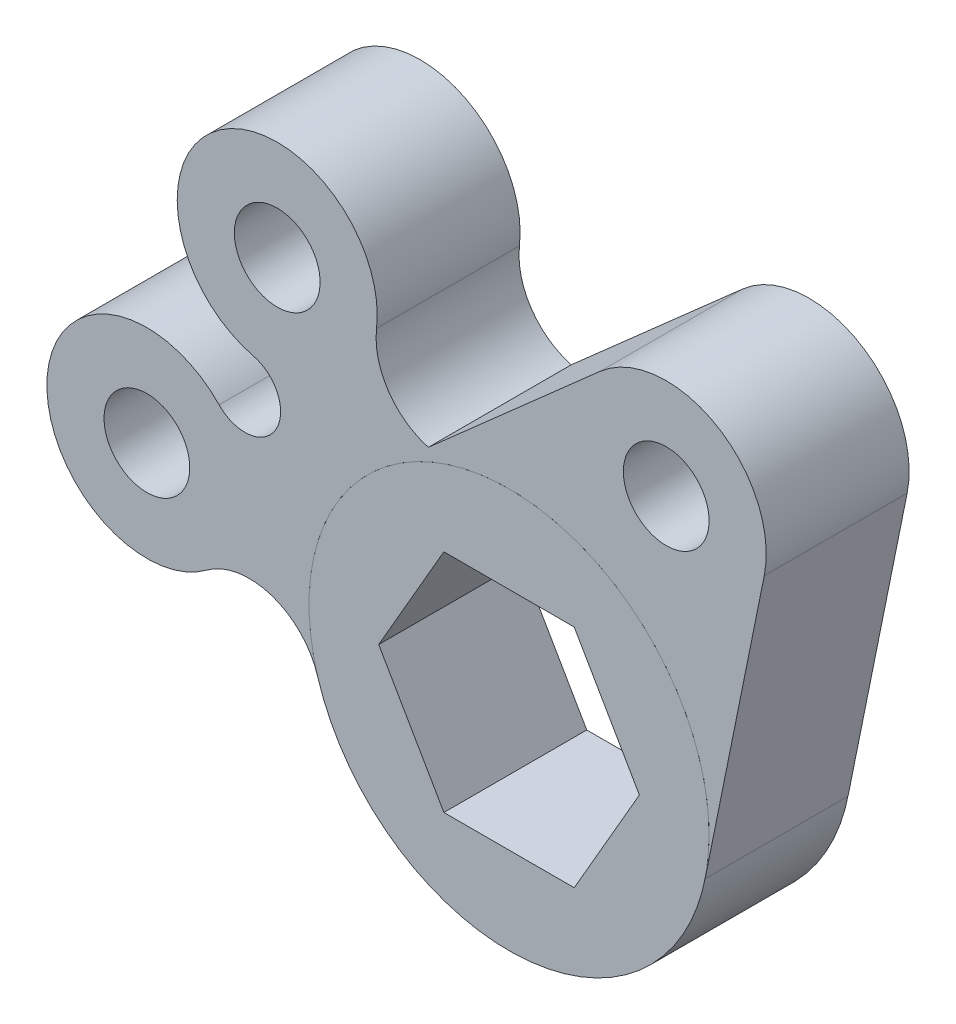
ISO-10303-21;
HEADER;
FILE_DESCRIPTION(('STEP AP214'),'2;1');
FILE_NAME('part.step','',(''),(''),'','','');
FILE_SCHEMA(('AUTOMOTIVE_DESIGN { 1 0 10303 214 1 1 1 1 }'));
ENDSEC;
DATA;
#1=APPLICATION_CONTEXT('core data for automotive mechanical design processes');
#2=APPLICATION_PROTOCOL_DEFINITION('international standard','automotive_design',2000,#1);
#3=PRODUCT_CONTEXT('',#1,'mechanical');
#4=PRODUCT('Part','Part','',(#3));
#5=PRODUCT_RELATED_PRODUCT_CATEGORY('part','',(#4));
#6=PRODUCT_DEFINITION_FORMATION('','',#4);
#7=PRODUCT_DEFINITION_CONTEXT('part definition',#1,'design');
#8=PRODUCT_DEFINITION('design','',#6,#7);
#9=PRODUCT_DEFINITION_SHAPE('','',#8);
#10=(LENGTH_UNIT() NAMED_UNIT(*) SI_UNIT(.MILLI.,.METRE.));
#11=(NAMED_UNIT(*) PLANE_ANGLE_UNIT() SI_UNIT($,.RADIAN.));
#12=(NAMED_UNIT(*) SI_UNIT($,.STERADIAN.) SOLID_ANGLE_UNIT());
#13=UNCERTAINTY_MEASURE_WITH_UNIT(LENGTH_MEASURE(1.E-05),#10,'distance_accuracy_value','');
#14=(GEOMETRIC_REPRESENTATION_CONTEXT(3) GLOBAL_UNCERTAINTY_ASSIGNED_CONTEXT((#13)) GLOBAL_UNIT_ASSIGNED_CONTEXT((#10,
#11,#12)) REPRESENTATION_CONTEXT('',''));
#15=CARTESIAN_POINT('',(0.,0.,0.));
#16=DIRECTION('',(0.,0.,1.));
#17=DIRECTION('',(1.,0.,0.));
#18=AXIS2_PLACEMENT_3D('',#15,#16,#17);
#19=CARTESIAN_POINT('',(-2.15239809910652,9.2529553345384,5.));
#20=DIRECTION('',(0.,0.,-1.));
#21=DIRECTION('',(-1.,0.,0.));
#22=AXIS2_PLACEMENT_3D('',#19,#20,#21);
#23=CYLINDRICAL_SURFACE('',#22,2.5);
#24=CARTESIAN_POINT('',(-2.15239809910652,9.2529553345384,0.));
#25=DIRECTION('',(0.,0.,-1.));
#26=DIRECTION('',(-1.,0.,0.));
#27=AXIS2_PLACEMENT_3D('',#24,#25,#26);
#28=CIRCLE('',#27,2.5);
#29=CARTESIAN_POINT('',(-2.82403678290388,6.84486449770791,0.));
#30=VERTEX_POINT('',#29);
#31=CARTESIAN_POINT('',(-4.63547025869307,9.54339061181407,0.));
#32=VERTEX_POINT('',#31);
#33=EDGE_CURVE('E157',#30,#32,#28,.T.);
#34=ORIENTED_EDGE('',*,*,#33,.T.);
#35=DIRECTION('',(0.,0.,-1.));
#36=VECTOR('',#35,1.);
#37=CARTESIAN_POINT('',(-4.63547025869307,9.54339061181407,5.));
#38=LINE('',#37,#36);
#39=CARTESIAN_POINT('',(-4.63547025869307,9.54339061181407,5.));
#40=VERTEX_POINT('',#39);
#41=EDGE_CURVE('E12',#40,#32,#38,.T.);
#42=ORIENTED_EDGE('',*,*,#41,.F.);
#43=CARTESIAN_POINT('',(-2.15239809910652,9.2529553345384,5.));
#44=DIRECTION('',(0.,0.,-1.));
#45=DIRECTION('',(-1.,0.,0.));
#46=AXIS2_PLACEMENT_3D('',#43,#44,#45);
#47=CIRCLE('',#46,2.5);
#48=CARTESIAN_POINT('',(-2.82403678290388,6.84486449770791,5.));
#49=VERTEX_POINT('',#48);
#50=EDGE_CURVE('E63',#49,#40,#47,.T.);
#51=ORIENTED_EDGE('',*,*,#50,.F.);
#52=DIRECTION('',(0.,0.,-1.));
#53=VECTOR('',#52,1.);
#54=CARTESIAN_POINT('',(-2.82403678290388,6.84486449770791,5.));
#55=LINE('',#54,#53);
#56=EDGE_CURVE('E48',#49,#30,#55,.T.);
#57=ORIENTED_EDGE('',*,*,#56,.T.);
#58=EDGE_LOOP('',(#34,#42,#51,#57));
#59=FACE_BOUND('',#58,.T.);
#60=ADVANCED_FACE('F45',(#59),#23,.F.);
#61=CARTESIAN_POINT('',(-8.11177128211424,9.95,5.));
#62=DIRECTION('',(0.,0.,-1.));
#63=DIRECTION('',(-1.,0.,0.));
#64=AXIS2_PLACEMENT_3D('',#61,#62,#63);
#65=CYLINDRICAL_SURFACE('',#64,3.5);
#66=CARTESIAN_POINT('',(-8.11177128211424,9.95,0.));
#67=DIRECTION('',(0.,0.,-1.));
#68=DIRECTION('',(-1.,0.,0.));
#69=AXIS2_PLACEMENT_3D('',#66,#67,#68);
#70=CIRCLE('',#69,3.5);
#71=CARTESIAN_POINT('',(-8.94579774924383,6.55082365092258,0.));
#72=VERTEX_POINT('',#71);
#73=EDGE_CURVE('E175',#72,#32,#70,.T.);
#74=ORIENTED_EDGE('',*,*,#73,.F.);
#75=DIRECTION('',(0.,0.,-1.));
#76=VECTOR('',#75,1.);
#77=CARTESIAN_POINT('',(-8.94579774924383,6.55082365092258,5.));
#78=LINE('',#77,#76);
#79=CARTESIAN_POINT('',(-8.94579774924383,6.55082365092258,5.));
#80=VERTEX_POINT('',#79);
#81=EDGE_CURVE('E54',#80,#72,#78,.T.);
#82=ORIENTED_EDGE('',*,*,#81,.F.);
#83=CARTESIAN_POINT('',(-8.11177128211424,9.95,5.));
#84=DIRECTION('',(0.,0.,-1.));
#85=DIRECTION('',(-1.,0.,0.));
#86=AXIS2_PLACEMENT_3D('',#83,#84,#85);
#87=CIRCLE('',#86,3.5);
#88=EDGE_CURVE('E129',#80,#40,#87,.T.);
#89=ORIENTED_EDGE('',*,*,#88,.T.);
#90=ORIENTED_EDGE('',*,*,#41,.T.);
#91=EDGE_LOOP('',(#74,#82,#89,#90));
#92=FACE_BOUND('',#91,.T.);
#93=ADVANCED_FACE('F205',(#92),#65,.T.);
#94=CARTESIAN_POINT('',(-9.24366434464725,5.33683209768064,5.));
#95=DIRECTION('',(0.,0.,-1.));
#96=DIRECTION('',(-1.,0.,0.));
#97=AXIS2_PLACEMENT_3D('',#94,#95,#96);
#98=CYLINDRICAL_SURFACE('',#97,1.25);
#99=CARTESIAN_POINT('',(-9.24366434464725,5.33683209768064,0.));
#100=DIRECTION('',(0.,0.,-1.));
#101=DIRECTION('',(-1.,0.,0.));
#102=AXIS2_PLACEMENT_3D('',#99,#100,#101);
#103=CIRCLE('',#102,1.25);
#104=CARTESIAN_POINT('',(-10.1460785720328,4.47187628250153,0.));
#105=VERTEX_POINT('',#104);
#106=EDGE_CURVE('E133',#72,#105,#103,.T.);
#107=ORIENTED_EDGE('',*,*,#106,.T.);
#108=DIRECTION('',(0.,0.,-1.));
#109=VECTOR('',#108,1.);
#110=CARTESIAN_POINT('',(-10.1460785720328,4.47187628250153,5.));
#111=LINE('',#110,#109);
#112=CARTESIAN_POINT('',(-10.1460785720328,4.47187628250153,5.));
#113=VERTEX_POINT('',#112);
#114=EDGE_CURVE('E131',#113,#105,#111,.T.);
#115=ORIENTED_EDGE('',*,*,#114,.F.);
#116=CARTESIAN_POINT('',(-9.24366434464725,5.33683209768064,5.));
#117=DIRECTION('',(0.,0.,-1.));
#118=DIRECTION('',(-1.,0.,0.));
#119=AXIS2_PLACEMENT_3D('',#116,#117,#118);
#120=CIRCLE('',#119,1.25);
#121=EDGE_CURVE('E123',#80,#113,#120,.T.);
#122=ORIENTED_EDGE('',*,*,#121,.F.);
#123=ORIENTED_EDGE('',*,*,#81,.T.);
#124=EDGE_LOOP('',(#107,#115,#122,#123));
#125=FACE_BOUND('',#124,.T.);
#126=ADVANCED_FACE('F132',(#125),#98,.F.);
#127=CARTESIAN_POINT('',(-12.6728384087123,2.05,5.));
#128=DIRECTION('',(0.,0.,-1.));
#129=DIRECTION('',(-1.,0.,0.));
#130=AXIS2_PLACEMENT_3D('',#127,#128,#129);
#131=CYLINDRICAL_SURFACE('',#130,3.5);
#132=CARTESIAN_POINT('',(-12.6728384087123,2.05,0.));
#133=DIRECTION('',(0.,0.,-1.));
#134=DIRECTION('',(-1.,0.,0.));
#135=AXIS2_PLACEMENT_3D('',#132,#133,#134);
#136=CIRCLE('',#135,3.5);
#137=CARTESIAN_POINT('',(-10.5825538374154,-0.757260303391609,0.));
#138=VERTEX_POINT('',#137);
#139=EDGE_CURVE('E172',#138,#105,#136,.T.);
#140=ORIENTED_EDGE('',*,*,#139,.F.);
#141=DIRECTION('',(0.,0.,-1.));
#142=VECTOR('',#141,1.);
#143=CARTESIAN_POINT('',(-10.5825538374154,-0.757260303391609,5.));
#144=LINE('',#143,#142);
#145=CARTESIAN_POINT('',(-10.5825538374154,-0.757260303391609,5.));
#146=VERTEX_POINT('',#145);
#147=EDGE_CURVE('E137',#146,#138,#144,.T.);
#148=ORIENTED_EDGE('',*,*,#147,.F.);
#149=CARTESIAN_POINT('',(-12.6728384087123,2.05,5.));
#150=DIRECTION('',(0.,0.,-1.));
#151=DIRECTION('',(-1.,0.,0.));
#152=AXIS2_PLACEMENT_3D('',#149,#150,#151);
#153=CIRCLE('',#152,3.5);
#154=EDGE_CURVE('E128',#146,#113,#153,.T.);
#155=ORIENTED_EDGE('',*,*,#154,.T.);
#156=ORIENTED_EDGE('',*,*,#114,.T.);
#157=EDGE_LOOP('',(#140,#148,#155,#156));
#158=FACE_BOUND('',#157,.T.);
#159=ADVANCED_FACE('F139',(#158),#131,.T.);
#160=CARTESIAN_POINT('',(-9.08949342934626,-2.76244623438561,5.));
#161=DIRECTION('',(0.,0.,-1.));
#162=DIRECTION('',(-1.,0.,0.));
#163=AXIS2_PLACEMENT_3D('',#160,#161,#162);
#164=CYLINDRICAL_SURFACE('',#163,2.5);
#165=CARTESIAN_POINT('',(-9.08949342934626,-2.76244623438561,0.));
#166=DIRECTION('',(0.,0.,-1.));
#167=DIRECTION('',(-1.,0.,0.));
#168=AXIS2_PLACEMENT_3D('',#165,#166,#167);
#169=CIRCLE('',#168,2.5);
#170=CARTESIAN_POINT('',(-6.69752147425514,-2.03548669902098,0.));
#171=VERTEX_POINT('',#170);
#172=EDGE_CURVE('E170',#138,#171,#169,.T.);
#173=ORIENTED_EDGE('',*,*,#172,.T.);
#174=DIRECTION('',(0.,0.,-1.));
#175=VECTOR('',#174,1.);
#176=CARTESIAN_POINT('',(-6.69752147425514,-2.03548669902098,5.));
#177=LINE('',#176,#175);
#178=CARTESIAN_POINT('',(-6.69752147425514,-2.03548669902098,5.));
#179=VERTEX_POINT('',#178);
#180=EDGE_CURVE('E189',#179,#171,#177,.T.);
#181=ORIENTED_EDGE('',*,*,#180,.F.);
#182=CARTESIAN_POINT('',(-9.08949342934626,-2.76244623438561,5.));
#183=DIRECTION('',(0.,0.,-1.));
#184=DIRECTION('',(-1.,0.,0.));
#185=AXIS2_PLACEMENT_3D('',#182,#183,#184);
#186=CIRCLE('',#185,2.5);
#187=EDGE_CURVE('E141',#146,#179,#186,.T.);
#188=ORIENTED_EDGE('',*,*,#187,.F.);
#189=ORIENTED_EDGE('',*,*,#147,.T.);
#190=EDGE_LOOP('',(#173,#181,#188,#189));
#191=FACE_BOUND('',#190,.T.);
#192=ADVANCED_FACE('F219',(#191),#164,.F.);
#193=CARTESIAN_POINT('',(0.,0.,5.));
#194=DIRECTION('',(0.,0.,-1.));
#195=DIRECTION('',(-1.,0.,0.));
#196=AXIS2_PLACEMENT_3D('',#193,#194,#195);
#197=CYLINDRICAL_SURFACE('',#196,7.);
#198=CARTESIAN_POINT('',(0.,0.,0.));
#199=DIRECTION('',(0.,0.,-1.));
#200=DIRECTION('',(-1.,0.,0.));
#201=AXIS2_PLACEMENT_3D('',#198,#199,#200);
#202=CIRCLE('',#201,7.);
#203=CARTESIAN_POINT('',(6.86076104896904,-1.38922922116877,0.));
#204=VERTEX_POINT('',#203);
#205=EDGE_CURVE('E167',#171,#204,#202,.T.);
#206=ORIENTED_EDGE('',*,*,#205,.T.);
#207=DIRECTION('',(0.,0.,-1.));
#208=VECTOR('',#207,1.);
#209=CARTESIAN_POINT('',(6.86076104896904,-1.38922922116877,5.));
#210=LINE('',#209,#208);
#211=CARTESIAN_POINT('',(6.86076104896904,-1.38922922116877,5.));
#212=VERTEX_POINT('',#211);
#213=EDGE_CURVE('E192',#212,#204,#210,.T.);
#214=ORIENTED_EDGE('',*,*,#213,.F.);
#215=CARTESIAN_POINT('',(0.,0.,5.));
#216=DIRECTION('',(0.,0.,-1.));
#217=DIRECTION('',(-1.,0.,0.));
#218=AXIS2_PLACEMENT_3D('',#215,#216,#217);
#219=CIRCLE('',#218,7.);
#220=EDGE_CURVE('E143',#179,#212,#219,.T.);
#221=ORIENTED_EDGE('',*,*,#220,.F.);
#222=ORIENTED_EDGE('',*,*,#180,.T.);
#223=EDGE_LOOP('',(#206,#214,#221,#222));
#224=FACE_BOUND('',#223,.T.);
#225=ADVANCED_FACE('F222',(#224),#197,.F.);
#226=CARTESIAN_POINT('',(6.86076104896904,-1.38922922116877,5.));
#227=DIRECTION('',(0.980108721281292,-0.198461317309825,0.));
#228=DIRECTION('',(0.198461317309825,0.980108721281292,0.));
#229=AXIS2_PLACEMENT_3D('',#226,#227,#228);
#230=PLANE('',#229);
#231=DIRECTION('',(-0.198461317309825,-0.980108721281292,0.));
#232=VECTOR('',#231,1.);
#233=CARTESIAN_POINT('',(6.86076104896904,-1.38922922116877,0.));
#234=LINE('',#233,#232);
#235=CARTESIAN_POINT('',(8.93038052448483,8.83166483104361,0.));
#236=VERTEX_POINT('',#235);
#237=EDGE_CURVE('E164',#236,#204,#234,.T.);
#238=ORIENTED_EDGE('',*,*,#237,.F.);
#239=DIRECTION('',(0.,0.,-1.));
#240=VECTOR('',#239,1.);
#241=CARTESIAN_POINT('',(8.93038052448483,8.83166483104361,5.));
#242=LINE('',#241,#240);
#243=CARTESIAN_POINT('',(8.93038052448483,8.83166483104361,5.));
#244=VERTEX_POINT('',#243);
#245=EDGE_CURVE('E194',#244,#236,#242,.T.);
#246=ORIENTED_EDGE('',*,*,#245,.F.);
#247=DIRECTION('',(-0.198461317309825,-0.980108721281292,0.));
#248=VECTOR('',#247,1.);
#249=CARTESIAN_POINT('',(6.86076104896904,-1.38922922116877,5.));
#250=LINE('',#249,#248);
#251=EDGE_CURVE('E405',#244,#212,#250,.T.);
#252=ORIENTED_EDGE('',*,*,#251,.T.);
#253=ORIENTED_EDGE('',*,*,#213,.T.);
#254=EDGE_LOOP('',(#238,#246,#252,#253));
#255=FACE_BOUND('',#254,.T.);
#256=ADVANCED_FACE('F226',(#255),#230,.T.);
#257=CARTESIAN_POINT('',(5.4999999999999,9.52627944162808,5.));
#258=DIRECTION('',(0.,0.,-1.));
#259=DIRECTION('',(-1.,0.,0.));
#260=AXIS2_PLACEMENT_3D('',#257,#258,#259);
#261=CYLINDRICAL_SURFACE('',#260,3.50000000000083);
#262=CARTESIAN_POINT('',(5.4999999999999,9.52627944162808,0.));
#263=DIRECTION('',(0.,0.,-1.));
#264=DIRECTION('',(-1.,0.,0.));
#265=AXIS2_PLACEMENT_3D('',#262,#263,#264);
#266=CIRCLE('',#265,3.50000000000083);
#267=CARTESIAN_POINT('',(3.18325583915159,12.1497688151873,0.));
#268=VERTEX_POINT('',#267);
#269=EDGE_CURVE('E161',#268,#236,#266,.T.);
#270=ORIENTED_EDGE('',*,*,#269,.F.);
#271=DIRECTION('',(0.,0.,-1.));
#272=VECTOR('',#271,1.);
#273=CARTESIAN_POINT('',(3.18325583915159,12.1497688151873,5.));
#274=LINE('',#273,#272);
#275=CARTESIAN_POINT('',(3.18325583915159,12.1497688151873,5.));
#276=VERTEX_POINT('',#275);
#277=EDGE_CURVE('E195',#276,#268,#274,.T.);
#278=ORIENTED_EDGE('',*,*,#277,.F.);
#279=CARTESIAN_POINT('',(5.4999999999999,9.52627944162808,5.));
#280=DIRECTION('',(0.,0.,-1.));
#281=DIRECTION('',(-1.,0.,0.));
#282=AXIS2_PLACEMENT_3D('',#279,#280,#281);
#283=CIRCLE('',#282,3.50000000000083);
#284=EDGE_CURVE('E408',#276,#244,#283,.T.);
#285=ORIENTED_EDGE('',*,*,#284,.T.);
#286=ORIENTED_EDGE('',*,*,#245,.T.);
#287=EDGE_LOOP('',(#270,#278,#285,#286));
#288=FACE_BOUND('',#287,.T.);
#289=ADVANCED_FACE('F230',(#288),#261,.T.);
#290=CARTESIAN_POINT('',(-12.6728384087123,2.05,5.));
#291=DIRECTION('',(0.,0.,-1.));
#292=DIRECTION('',(-1.,0.,0.));
#293=AXIS2_PLACEMENT_3D('',#290,#291,#292);
#294=CYLINDRICAL_SURFACE('',#293,1.5);
#295=CARTESIAN_POINT('',(-12.6728384087123,2.05,5.));
#296=DIRECTION('',(0.,0.,-1.));
#297=DIRECTION('',(-1.,0.,0.));
#298=AXIS2_PLACEMENT_3D('',#295,#296,#297);
#299=CIRCLE('',#298,1.5);
#300=CARTESIAN_POINT('',(-14.1728384087123,2.05,5.));
#301=VERTEX_POINT('',#300);
#302=EDGE_CURVE('E151',#301,#301,#299,.T.);
#303=ORIENTED_EDGE('',*,*,#302,.F.);
#304=EDGE_LOOP('',(#303));
#305=FACE_BOUND('',#304,.T.);
#306=CARTESIAN_POINT('',(-12.6728384087123,2.05,0.));
#307=DIRECTION('',(0.,0.,-1.));
#308=DIRECTION('',(-1.,0.,0.));
#309=AXIS2_PLACEMENT_3D('',#306,#307,#308);
#310=CIRCLE('',#309,1.5);
#311=CARTESIAN_POINT('',(-14.1728384087123,2.05,0.));
#312=VERTEX_POINT('',#311);
#313=EDGE_CURVE('E181',#312,#312,#310,.T.);
#314=ORIENTED_EDGE('',*,*,#313,.T.);
#315=EDGE_LOOP('',(#314));
#316=FACE_BOUND('',#315,.T.);
#317=ADVANCED_FACE('F233',(#305,#316),#294,.F.);
#318=CARTESIAN_POINT('',(-8.11177128211424,9.95,5.));
#319=DIRECTION('',(0.,0.,-1.));
#320=DIRECTION('',(-1.,0.,0.));
#321=AXIS2_PLACEMENT_3D('',#318,#319,#320);
#322=CYLINDRICAL_SURFACE('',#321,1.5);
#323=CARTESIAN_POINT('',(-8.11177128211424,9.95,5.));
#324=DIRECTION('',(0.,0.,-1.));
#325=DIRECTION('',(-1.,0.,0.));
#326=AXIS2_PLACEMENT_3D('',#323,#324,#325);
#327=CIRCLE('',#326,1.5);
#328=CARTESIAN_POINT('',(-9.61177128211424,9.95,5.));
#329=VERTEX_POINT('',#328);
#330=EDGE_CURVE('E148',#329,#329,#327,.T.);
#331=ORIENTED_EDGE('',*,*,#330,.F.);
#332=EDGE_LOOP('',(#331));
#333=FACE_BOUND('',#332,.T.);
#334=CARTESIAN_POINT('',(-8.11177128211424,9.95,0.));
#335=DIRECTION('',(0.,0.,-1.));
#336=DIRECTION('',(-1.,0.,0.));
#337=AXIS2_PLACEMENT_3D('',#334,#335,#336);
#338=CIRCLE('',#337,1.5);
#339=CARTESIAN_POINT('',(-9.61177128211424,9.95,0.));
#340=VERTEX_POINT('',#339);
#341=EDGE_CURVE('E178',#340,#340,#338,.T.);
#342=ORIENTED_EDGE('',*,*,#341,.T.);
#343=EDGE_LOOP('',(#342));
#344=FACE_BOUND('',#343,.T.);
#345=ADVANCED_FACE('F214',(#333,#344),#322,.F.);
#346=CARTESIAN_POINT('',(-4.63348832169607,5.24697874711782,5.));
#347=DIRECTION('',(0.661926903099439,-0.749568392445403,0.));
#348=DIRECTION('',(0.749568392445403,0.661926903099439,0.));
#349=AXIS2_PLACEMENT_3D('',#346,#347,#348);
#350=PLANE('',#349);
#351=DIRECTION('',(-0.749568392445403,-0.661926903099439,0.));
#352=VECTOR('',#351,1.);
#353=CARTESIAN_POINT('',(-4.63348832169607,5.24697874711782,0.));
#354=LINE('',#353,#352);
#355=EDGE_CURVE('E159',#268,#30,#354,.T.);
#356=ORIENTED_EDGE('',*,*,#355,.T.);
#357=ORIENTED_EDGE('',*,*,#56,.F.);
#358=DIRECTION('',(-0.749568392445403,-0.661926903099439,0.));
#359=VECTOR('',#358,1.);
#360=CARTESIAN_POINT('',(-4.63348832169607,5.24697874711782,5.));
#361=LINE('',#360,#359);
#362=EDGE_CURVE('E105',#276,#49,#361,.T.);
#363=ORIENTED_EDGE('',*,*,#362,.F.);
#364=ORIENTED_EDGE('',*,*,#277,.T.);
#365=EDGE_LOOP('',(#356,#357,#363,#364));
#366=FACE_BOUND('',#365,.T.);
#367=ADVANCED_FACE('F235',(#366),#350,.F.);
#368=CARTESIAN_POINT('',(5.4999999999999,9.52627944162808,5.));
#369=DIRECTION('',(0.,0.,-1.));
#370=DIRECTION('',(-1.,0.,0.));
#371=AXIS2_PLACEMENT_3D('',#368,#369,#370);
#372=CYLINDRICAL_SURFACE('',#371,1.50000000000083);
#373=CARTESIAN_POINT('',(5.4999999999999,9.52627944162808,5.));
#374=DIRECTION('',(0.,0.,-1.));
#375=DIRECTION('',(-1.,0.,0.));
#376=AXIS2_PLACEMENT_3D('',#373,#374,#375);
#377=CIRCLE('',#376,1.50000000000083);
#378=CARTESIAN_POINT('',(3.99999999999907,9.52627944162808,5.));
#379=VERTEX_POINT('',#378);
#380=EDGE_CURVE('E154',#379,#379,#377,.T.);
#381=ORIENTED_EDGE('',*,*,#380,.F.);
#382=EDGE_LOOP('',(#381));
#383=FACE_BOUND('',#382,.T.);
#384=CARTESIAN_POINT('',(5.4999999999999,9.52627944162808,0.));
#385=DIRECTION('',(0.,0.,-1.));
#386=DIRECTION('',(-1.,0.,0.));
#387=AXIS2_PLACEMENT_3D('',#384,#385,#386);
#388=CIRCLE('',#387,1.50000000000083);
#389=CARTESIAN_POINT('',(3.99999999999907,9.52627944162808,0.));
#390=VERTEX_POINT('',#389);
#391=EDGE_CURVE('E184',#390,#390,#388,.T.);
#392=ORIENTED_EDGE('',*,*,#391,.T.);
#393=EDGE_LOOP('',(#392));
#394=FACE_BOUND('',#393,.T.);
#395=ADVANCED_FACE('F237',(#383,#394),#372,.F.);
#396=CARTESIAN_POINT('',(0.,0.,5.));
#397=DIRECTION('',(0.,0.,-1.));
#398=DIRECTION('',(-1.,0.,0.));
#399=AXIS2_PLACEMENT_3D('',#396,#397,#398);
#400=PLANE('',#399);
#401=ORIENTED_EDGE('',*,*,#50,.T.);
#402=ORIENTED_EDGE('',*,*,#88,.F.);
#403=ORIENTED_EDGE('',*,*,#121,.T.);
#404=ORIENTED_EDGE('',*,*,#154,.F.);
#405=ORIENTED_EDGE('',*,*,#187,.T.);
#406=ORIENTED_EDGE('',*,*,#220,.T.);
#407=ORIENTED_EDGE('',*,*,#251,.F.);
#408=ORIENTED_EDGE('',*,*,#284,.F.);
#409=ORIENTED_EDGE('',*,*,#362,.T.);
#410=EDGE_LOOP('',(#401,#402,#403,#404,#405,#406,#407,#408,#409));
#411=FACE_BOUND('',#410,.T.);
#412=ORIENTED_EDGE('',*,*,#330,.T.);
#413=EDGE_LOOP('',(#412));
#414=FACE_BOUND('',#413,.T.);
#415=ORIENTED_EDGE('',*,*,#302,.T.);
#416=EDGE_LOOP('',(#415));
#417=FACE_BOUND('',#416,.T.);
#418=ORIENTED_EDGE('',*,*,#380,.T.);
#419=EDGE_LOOP('',(#418));
#420=FACE_BOUND('',#419,.T.);
#421=ADVANCED_FACE('F125',(#411,#414,#417,#420),#400,.F.);
#422=CARTESIAN_POINT('',(0.,0.,0.));
#423=DIRECTION('',(0.,0.,-1.));
#424=DIRECTION('',(-1.,0.,0.));
#425=AXIS2_PLACEMENT_3D('',#422,#423,#424);
#426=PLANE('',#425);
#427=ORIENTED_EDGE('',*,*,#33,.F.);
#428=ORIENTED_EDGE('',*,*,#355,.F.);
#429=ORIENTED_EDGE('',*,*,#269,.T.);
#430=ORIENTED_EDGE('',*,*,#237,.T.);
#431=ORIENTED_EDGE('',*,*,#205,.F.);
#432=ORIENTED_EDGE('',*,*,#172,.F.);
#433=ORIENTED_EDGE('',*,*,#139,.T.);
#434=ORIENTED_EDGE('',*,*,#106,.F.);
#435=ORIENTED_EDGE('',*,*,#73,.T.);
#436=EDGE_LOOP('',(#427,#428,#429,#430,#431,#432,#433,#434,#435));
#437=FACE_BOUND('',#436,.T.);
#438=ORIENTED_EDGE('',*,*,#341,.F.);
#439=EDGE_LOOP('',(#438));
#440=FACE_BOUND('',#439,.T.);
#441=ORIENTED_EDGE('',*,*,#313,.F.);
#442=EDGE_LOOP('',(#441));
#443=FACE_BOUND('',#442,.T.);
#444=ORIENTED_EDGE('',*,*,#391,.F.);
#445=EDGE_LOOP('',(#444));
#446=FACE_BOUND('',#445,.T.);
#447=ADVANCED_FACE('F202',(#437,#440,#443,#446),#426,.T.);
#448=CLOSED_SHELL('',(#60,#93,#126,#159,#192,#225,#256,#289,#317,#345,#367,#395,#421,#447));
#449=MANIFOLD_SOLID_BREP('B2',#448);
#450=CARTESIAN_POINT('',(0.,0.,5.));
#451=DIRECTION('',(0.,0.,1.));
#452=DIRECTION('',(1.,0.,0.));
#453=AXIS2_PLACEMENT_3D('',#450,#451,#452);
#454=PLANE('',#453);
#455=CARTESIAN_POINT('',(0.,0.,5.));
#456=DIRECTION('',(0.,0.,1.));
#457=DIRECTION('',(1.,0.,0.));
#458=AXIS2_PLACEMENT_3D('',#455,#456,#457);
#459=CIRCLE('',#458,7.);
#460=CARTESIAN_POINT('',(7.,0.,5.));
#461=VERTEX_POINT('',#460);
#462=EDGE_CURVE('E43',#461,#461,#459,.T.);
#463=ORIENTED_EDGE('',*,*,#462,.T.);
#464=EDGE_LOOP('',(#463));
#465=FACE_BOUND('',#464,.T.);
#466=DIRECTION('',(0.5,0.866025403784439,0.));
#467=VECTOR('',#466,1.);
#468=CARTESIAN_POINT('',(2.28053356329902,-3.95,5.));
#469=LINE('',#468,#467);
#470=CARTESIAN_POINT('',(2.28053356329902,-3.95,5.));
#471=VERTEX_POINT('',#470);
#472=CARTESIAN_POINT('',(4.56106712659804,0.,5.));
#473=VERTEX_POINT('',#472);
#474=EDGE_CURVE('E476',#471,#473,#469,.T.);
#475=ORIENTED_EDGE('',*,*,#474,.F.);
#476=DIRECTION('',(1.,0.,0.));
#477=VECTOR('',#476,1.);
#478=CARTESIAN_POINT('',(-2.28053356329902,-3.95,5.));
#479=LINE('',#478,#477);
#480=CARTESIAN_POINT('',(-2.28053356329902,-3.95,5.));
#481=VERTEX_POINT('',#480);
#482=EDGE_CURVE('E468',#481,#471,#479,.T.);
#483=ORIENTED_EDGE('',*,*,#482,.F.);
#484=DIRECTION('',(0.5,-0.866025403784439,0.));
#485=VECTOR('',#484,1.);
#486=CARTESIAN_POINT('',(-4.56106712659804,0.,5.));
#487=LINE('',#486,#485);
#488=CARTESIAN_POINT('',(-4.56106712659805,0.,5.));
#489=VERTEX_POINT('',#488);
#490=EDGE_CURVE('E496',#489,#481,#487,.T.);
#491=ORIENTED_EDGE('',*,*,#490,.F.);
#492=DIRECTION('',(-0.5,-0.866025403784439,0.));
#493=VECTOR('',#492,1.);
#494=CARTESIAN_POINT('',(-2.28053356329902,3.95,5.));
#495=LINE('',#494,#493);
#496=CARTESIAN_POINT('',(-2.28053356329902,3.95,5.));
#497=VERTEX_POINT('',#496);
#498=EDGE_CURVE('E494',#497,#489,#495,.T.);
#499=ORIENTED_EDGE('',*,*,#498,.F.);
#500=DIRECTION('',(-1.,0.,0.));
#501=VECTOR('',#500,1.);
#502=CARTESIAN_POINT('',(2.28053356329902,3.95,5.));
#503=LINE('',#502,#501);
#504=CARTESIAN_POINT('',(2.28053356329902,3.95,5.));
#505=VERTEX_POINT('',#504);
#506=EDGE_CURVE('E490',#505,#497,#503,.T.);
#507=ORIENTED_EDGE('',*,*,#506,.F.);
#508=DIRECTION('',(-0.5,0.866025403784439,0.));
#509=VECTOR('',#508,1.);
#510=CARTESIAN_POINT('',(4.56106712659804,0.,5.));
#511=LINE('',#510,#509);
#512=EDGE_CURVE('E488',#473,#505,#511,.T.);
#513=ORIENTED_EDGE('',*,*,#512,.F.);
#514=EDGE_LOOP('',(#475,#483,#491,#499,#507,#513));
#515=FACE_BOUND('',#514,.T.);
#516=ADVANCED_FACE('F415',(#465,#515),#454,.T.);
#517=CARTESIAN_POINT('',(0.,0.,0.));
#518=DIRECTION('',(0.,0.,1.));
#519=DIRECTION('',(1.,0.,0.));
#520=AXIS2_PLACEMENT_3D('',#517,#518,#519);
#521=PLANE('',#520);
#522=CARTESIAN_POINT('',(0.,0.,0.));
#523=DIRECTION('',(0.,0.,1.));
#524=DIRECTION('',(1.,0.,0.));
#525=AXIS2_PLACEMENT_3D('',#522,#523,#524);
#526=CIRCLE('',#525,7.);
#527=CARTESIAN_POINT('',(7.,0.,0.));
#528=VERTEX_POINT('',#527);
#529=EDGE_CURVE('E419',#528,#528,#526,.T.);
#530=ORIENTED_EDGE('',*,*,#529,.F.);
#531=EDGE_LOOP('',(#530));
#532=FACE_BOUND('',#531,.T.);
#533=DIRECTION('',(1.,0.,0.));
#534=VECTOR('',#533,1.);
#535=CARTESIAN_POINT('',(-2.28053356329902,-3.95,0.));
#536=LINE('',#535,#534);
#537=CARTESIAN_POINT('',(-2.28053356329902,-3.95,0.));
#538=VERTEX_POINT('',#537);
#539=CARTESIAN_POINT('',(2.28053356329902,-3.95,0.));
#540=VERTEX_POINT('',#539);
#541=EDGE_CURVE('E438',#538,#540,#536,.T.);
#542=ORIENTED_EDGE('',*,*,#541,.T.);
#543=DIRECTION('',(0.5,0.866025403784439,0.));
#544=VECTOR('',#543,1.);
#545=CARTESIAN_POINT('',(2.28053356329902,-3.95,0.));
#546=LINE('',#545,#544);
#547=CARTESIAN_POINT('',(4.56106712659804,0.,0.));
#548=VERTEX_POINT('',#547);
#549=EDGE_CURVE('E483',#540,#548,#546,.T.);
#550=ORIENTED_EDGE('',*,*,#549,.T.);
#551=DIRECTION('',(-0.5,0.866025403784439,0.));
#552=VECTOR('',#551,1.);
#553=CARTESIAN_POINT('',(4.56106712659804,0.,0.));
#554=LINE('',#553,#552);
#555=CARTESIAN_POINT('',(2.28053356329902,3.95,0.));
#556=VERTEX_POINT('',#555);
#557=EDGE_CURVE('E500',#548,#556,#554,.T.);
#558=ORIENTED_EDGE('',*,*,#557,.T.);
#559=DIRECTION('',(-1.,0.,0.));
#560=VECTOR('',#559,1.);
#561=CARTESIAN_POINT('',(2.28053356329902,3.95,0.));
#562=LINE('',#561,#560);
#563=CARTESIAN_POINT('',(-2.28053356329902,3.95,0.));
#564=VERTEX_POINT('',#563);
#565=EDGE_CURVE('E503',#556,#564,#562,.T.);
#566=ORIENTED_EDGE('',*,*,#565,.T.);
#567=DIRECTION('',(-0.5,-0.866025403784439,0.));
#568=VECTOR('',#567,1.);
#569=CARTESIAN_POINT('',(-2.28053356329902,3.95,0.));
#570=LINE('',#569,#568);
#571=CARTESIAN_POINT('',(-4.56106712659804,0.,0.));
#572=VERTEX_POINT('',#571);
#573=EDGE_CURVE('E506',#564,#572,#570,.T.);
#574=ORIENTED_EDGE('',*,*,#573,.T.);
#575=DIRECTION('',(0.5,-0.866025403784439,0.));
#576=VECTOR('',#575,1.);
#577=CARTESIAN_POINT('',(-4.56106712659804,0.,0.));
#578=LINE('',#577,#576);
#579=EDGE_CURVE('E477',#572,#538,#578,.T.);
#580=ORIENTED_EDGE('',*,*,#579,.T.);
#581=EDGE_LOOP('',(#542,#550,#558,#566,#574,#580));
#582=FACE_BOUND('',#581,.T.);
#583=ADVANCED_FACE('F523',(#532,#582),#521,.F.);
#584=CARTESIAN_POINT('',(0.,0.,5.));
#585=DIRECTION('',(0.,0.,-1.));
#586=DIRECTION('',(-1.,0.,0.));
#587=AXIS2_PLACEMENT_3D('',#584,#585,#586);
#588=CYLINDRICAL_SURFACE('',#587,7.);
#589=ORIENTED_EDGE('',*,*,#462,.F.);
#590=EDGE_LOOP('',(#589));
#591=FACE_BOUND('',#590,.T.);
#592=ORIENTED_EDGE('',*,*,#529,.T.);
#593=EDGE_LOOP('',(#592));
#594=FACE_BOUND('',#593,.T.);
#595=ADVANCED_FACE('F417',(#591,#594),#588,.T.);
#596=CARTESIAN_POINT('',(-2.28053356329902,-3.95,5.));
#597=DIRECTION('',(0.,1.,0.));
#598=DIRECTION('',(-1.,0.,0.));
#599=AXIS2_PLACEMENT_3D('',#596,#597,#598);
#600=PLANE('',#599);
#601=ORIENTED_EDGE('',*,*,#541,.F.);
#602=DIRECTION('',(0.,0.,-1.));
#603=VECTOR('',#602,1.);
#604=CARTESIAN_POINT('',(-2.28053356329902,-3.95,5.));
#605=LINE('',#604,#603);
#606=EDGE_CURVE('E472',#481,#538,#605,.T.);
#607=ORIENTED_EDGE('',*,*,#606,.F.);
#608=ORIENTED_EDGE('',*,*,#482,.T.);
#609=DIRECTION('',(0.,0.,-1.));
#610=VECTOR('',#609,1.);
#611=CARTESIAN_POINT('',(2.28053356329902,-3.95,5.));
#612=LINE('',#611,#610);
#613=EDGE_CURVE('E471',#471,#540,#612,.T.);
#614=ORIENTED_EDGE('',*,*,#613,.T.);
#615=EDGE_LOOP('',(#601,#607,#608,#614));
#616=FACE_BOUND('',#615,.T.);
#617=ADVANCED_FACE('F470',(#616),#600,.T.);
#618=CARTESIAN_POINT('',(2.28053356329902,-3.95,5.));
#619=DIRECTION('',(-0.866025403784439,0.5,0.));
#620=DIRECTION('',(-0.5,-0.866025403784439,0.));
#621=AXIS2_PLACEMENT_3D('',#618,#619,#620);
#622=PLANE('',#621);
#623=ORIENTED_EDGE('',*,*,#549,.F.);
#624=ORIENTED_EDGE('',*,*,#613,.F.);
#625=ORIENTED_EDGE('',*,*,#474,.T.);
#626=DIRECTION('',(0.,0.,-1.));
#627=VECTOR('',#626,1.);
#628=CARTESIAN_POINT('',(4.56106712659804,0.,5.));
#629=LINE('',#628,#627);
#630=EDGE_CURVE('E484',#473,#548,#629,.T.);
#631=ORIENTED_EDGE('',*,*,#630,.T.);
#632=EDGE_LOOP('',(#623,#624,#625,#631));
#633=FACE_BOUND('',#632,.T.);
#634=ADVANCED_FACE('F480',(#633),#622,.T.);
#635=CARTESIAN_POINT('',(4.56106712659804,0.,5.));
#636=DIRECTION('',(-0.866025403784438,-0.5,0.));
#637=DIRECTION('',(0.5,-0.866025403784439,0.));
#638=AXIS2_PLACEMENT_3D('',#635,#636,#637);
#639=PLANE('',#638);
#640=ORIENTED_EDGE('',*,*,#557,.F.);
#641=ORIENTED_EDGE('',*,*,#630,.F.);
#642=ORIENTED_EDGE('',*,*,#512,.T.);
#643=DIRECTION('',(0.,0.,-1.));
#644=VECTOR('',#643,1.);
#645=CARTESIAN_POINT('',(2.28053356329902,3.95,5.));
#646=LINE('',#645,#644);
#647=EDGE_CURVE('E515',#505,#556,#646,.T.);
#648=ORIENTED_EDGE('',*,*,#647,.T.);
#649=EDGE_LOOP('',(#640,#641,#642,#648));
#650=FACE_BOUND('',#649,.T.);
#651=ADVANCED_FACE('F519',(#650),#639,.T.);
#652=CARTESIAN_POINT('',(2.28053356329902,3.95,5.));
#653=DIRECTION('',(0.,-1.,0.));
#654=DIRECTION('',(1.,0.,0.));
#655=AXIS2_PLACEMENT_3D('',#652,#653,#654);
#656=PLANE('',#655);
#657=ORIENTED_EDGE('',*,*,#565,.F.);
#658=ORIENTED_EDGE('',*,*,#647,.F.);
#659=ORIENTED_EDGE('',*,*,#506,.T.);
#660=DIRECTION('',(0.,0.,-1.));
#661=VECTOR('',#660,1.);
#662=CARTESIAN_POINT('',(-2.28053356329902,3.95,5.));
#663=LINE('',#662,#661);
#664=EDGE_CURVE('E513',#497,#564,#663,.T.);
#665=ORIENTED_EDGE('',*,*,#664,.T.);
#666=EDGE_LOOP('',(#657,#658,#659,#665));
#667=FACE_BOUND('',#666,.T.);
#668=ADVANCED_FACE('F531',(#667),#656,.T.);
#669=CARTESIAN_POINT('',(-2.28053356329902,3.95,5.));
#670=DIRECTION('',(0.866025403784439,-0.5,0.));
#671=DIRECTION('',(0.5,0.866025403784439,0.));
#672=AXIS2_PLACEMENT_3D('',#669,#670,#671);
#673=PLANE('',#672);
#674=ORIENTED_EDGE('',*,*,#573,.F.);
#675=ORIENTED_EDGE('',*,*,#664,.F.);
#676=ORIENTED_EDGE('',*,*,#498,.T.);
#677=DIRECTION('',(0.,0.,-1.));
#678=VECTOR('',#677,1.);
#679=CARTESIAN_POINT('',(-4.56106712659804,0.,5.));
#680=LINE('',#679,#678);
#681=EDGE_CURVE('E430',#489,#572,#680,.T.);
#682=ORIENTED_EDGE('',*,*,#681,.T.);
#683=EDGE_LOOP('',(#674,#675,#676,#682));
#684=FACE_BOUND('',#683,.T.);
#685=ADVANCED_FACE('F529',(#684),#673,.T.);
#686=CARTESIAN_POINT('',(-4.56106712659804,0.,5.));
#687=DIRECTION('',(0.866025403784439,0.5,0.));
#688=DIRECTION('',(-0.5,0.866025403784439,0.));
#689=AXIS2_PLACEMENT_3D('',#686,#687,#688);
#690=PLANE('',#689);
#691=ORIENTED_EDGE('',*,*,#579,.F.);
#692=ORIENTED_EDGE('',*,*,#681,.F.);
#693=ORIENTED_EDGE('',*,*,#490,.T.);
#694=ORIENTED_EDGE('',*,*,#606,.T.);
#695=EDGE_LOOP('',(#691,#692,#693,#694));
#696=FACE_BOUND('',#695,.T.);
#697=ADVANCED_FACE('F525',(#696),#690,.T.);
#698=CLOSED_SHELL('',(#516,#583,#595,#617,#634,#651,#668,#685,#697));
#699=MANIFOLD_SOLID_BREP('B6',#698);
#700=ADVANCED_BREP_SHAPE_REPRESENTATION('',(#18,#449,#699),#14);
#701=SHAPE_DEFINITION_REPRESENTATION(#9,#700);
ENDSEC;
END-ISO-10303-21;
